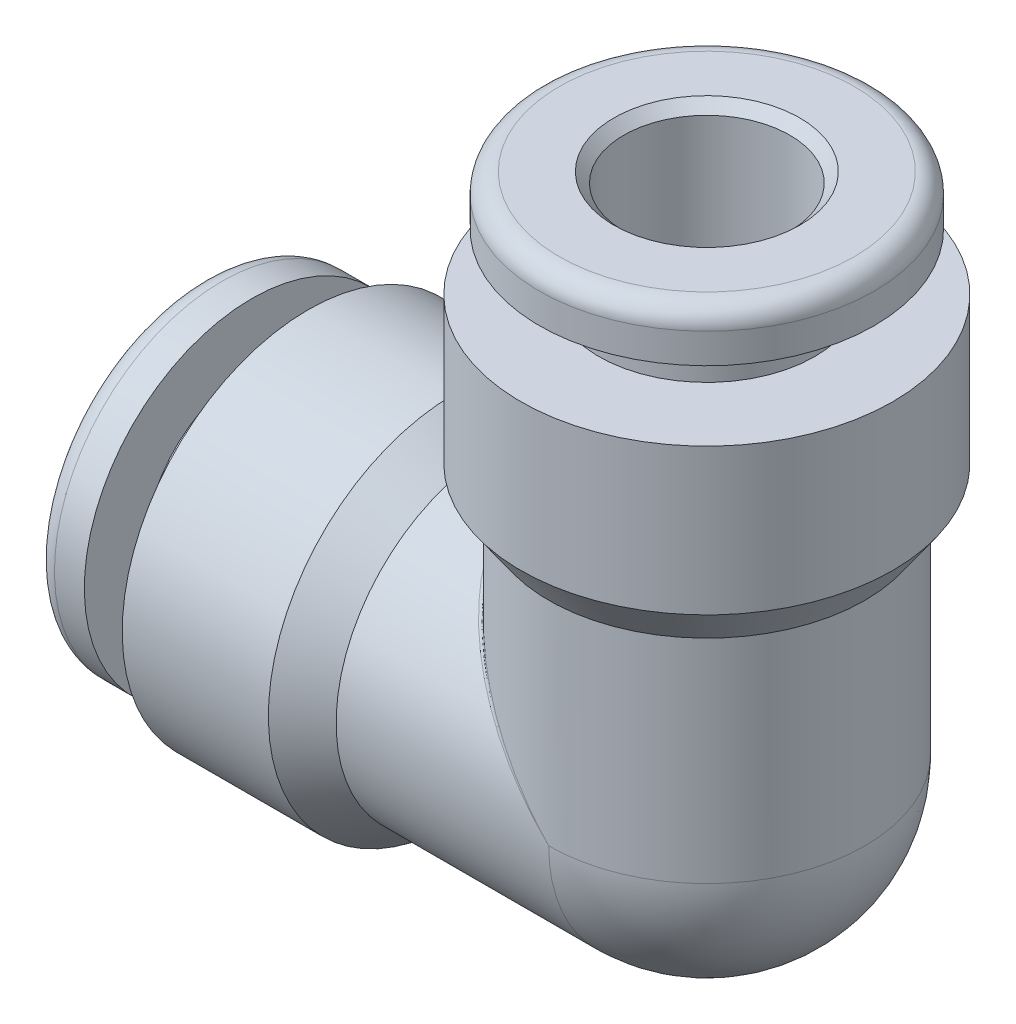
ISO-10303-21;
HEADER;
FILE_DESCRIPTION(('STEP AP214'),'2;1');
FILE_NAME('part.step','',(''),(''),'','','');
FILE_SCHEMA(('AUTOMOTIVE_DESIGN { 1 0 10303 214 1 1 1 1 }'));
ENDSEC;
DATA;
#1=APPLICATION_CONTEXT('core data for automotive mechanical design processes');
#2=APPLICATION_PROTOCOL_DEFINITION('international standard','automotive_design',2000,#1);
#3=PRODUCT_CONTEXT('',#1,'mechanical');
#4=PRODUCT('Part','Part','',(#3));
#5=PRODUCT_RELATED_PRODUCT_CATEGORY('part','',(#4));
#6=PRODUCT_DEFINITION_FORMATION('','',#4);
#7=PRODUCT_DEFINITION_CONTEXT('part definition',#1,'design');
#8=PRODUCT_DEFINITION('design','',#6,#7);
#9=PRODUCT_DEFINITION_SHAPE('','',#8);
#10=(LENGTH_UNIT() NAMED_UNIT(*) SI_UNIT(.MILLI.,.METRE.));
#11=(NAMED_UNIT(*) PLANE_ANGLE_UNIT() SI_UNIT($,.RADIAN.));
#12=(NAMED_UNIT(*) SI_UNIT($,.STERADIAN.) SOLID_ANGLE_UNIT());
#13=UNCERTAINTY_MEASURE_WITH_UNIT(LENGTH_MEASURE(1.E-05),#10,'distance_accuracy_value','');
#14=(GEOMETRIC_REPRESENTATION_CONTEXT(3) GLOBAL_UNCERTAINTY_ASSIGNED_CONTEXT((#13)) GLOBAL_UNIT_ASSIGNED_CONTEXT((#10,
#11,#12)) REPRESENTATION_CONTEXT('',''));
#15=CARTESIAN_POINT('',(0.,0.,0.));
#16=DIRECTION('',(0.,0.,1.));
#17=DIRECTION('',(1.,0.,0.));
#18=AXIS2_PLACEMENT_3D('',#15,#16,#17);
#19=CARTESIAN_POINT('',(-8.12845170640751,0.,0.));
#20=DIRECTION('',(-1.,0.,0.));
#21=DIRECTION('',(0.,-1.,0.));
#22=AXIS2_PLACEMENT_3D('',#19,#20,#21);
#23=CONICAL_SURFACE('',#22,6.0452,0.610865238198017);
#24=CARTESIAN_POINT('',(-9.652,0.,0.));
#25=DIRECTION('',(1.,0.,0.));
#26=DIRECTION('',(0.,1.,0.));
#27=AXIS2_PLACEMENT_3D('',#24,#25,#26);
#28=CIRCLE('',#27,7.112);
#29=CARTESIAN_POINT('',(-9.652,7.112,0.));
#30=VERTEX_POINT('',#29);
#31=EDGE_CURVE('E71',#30,#30,#28,.T.);
#32=ORIENTED_EDGE('',*,*,#31,.T.);
#33=EDGE_LOOP('',(#32));
#34=FACE_BOUND('',#33,.T.);
#35=CARTESIAN_POINT('',(-8.12845170640751,0.,0.));
#36=DIRECTION('',(1.,0.,0.));
#37=DIRECTION('',(0.,1.,0.));
#38=AXIS2_PLACEMENT_3D('',#35,#36,#37);
#39=CIRCLE('',#38,6.0452);
#40=CARTESIAN_POINT('',(-8.12845170640751,6.0452,0.));
#41=VERTEX_POINT('',#40);
#42=EDGE_CURVE('E77',#41,#41,#39,.T.);
#43=ORIENTED_EDGE('',*,*,#42,.F.);
#44=EDGE_LOOP('',(#43));
#45=FACE_BOUND('',#44,.T.);
#46=ADVANCED_FACE('F34',(#34,#45),#23,.T.);
#47=CARTESIAN_POINT('',(0.,0.,0.));
#48=DIRECTION('',(1.,0.,0.));
#49=DIRECTION('',(0.,1.,0.));
#50=AXIS2_PLACEMENT_3D('',#47,#48,#49);
#51=CYLINDRICAL_SURFACE('',#50,7.112);
#52=CARTESIAN_POINT('',(-15.24,0.,0.));
#53=DIRECTION('',(1.,0.,0.));
#54=DIRECTION('',(0.,1.,0.));
#55=AXIS2_PLACEMENT_3D('',#52,#53,#54);
#56=CIRCLE('',#55,7.112);
#57=CARTESIAN_POINT('',(-15.24,7.112,0.));
#58=VERTEX_POINT('',#57);
#59=EDGE_CURVE('E153',#58,#58,#56,.T.);
#60=ORIENTED_EDGE('',*,*,#59,.T.);
#61=EDGE_LOOP('',(#60));
#62=FACE_BOUND('',#61,.T.);
#63=ORIENTED_EDGE('',*,*,#31,.F.);
#64=EDGE_LOOP('',(#63));
#65=FACE_BOUND('',#64,.T.);
#66=ADVANCED_FACE('F161',(#62,#65),#51,.T.);
#67=CARTESIAN_POINT('',(-15.24,7.112,0.));
#68=DIRECTION('',(-1.,0.,0.));
#69=DIRECTION('',(0.,-1.,0.));
#70=AXIS2_PLACEMENT_3D('',#67,#68,#69);
#71=PLANE('',#70);
#72=CARTESIAN_POINT('',(-15.24,0.,0.));
#73=DIRECTION('',(1.,0.,0.));
#74=DIRECTION('',(0.,1.,0.));
#75=AXIS2_PLACEMENT_3D('',#72,#73,#74);
#76=CIRCLE('',#75,4.1275);
#77=CARTESIAN_POINT('',(-15.24,4.1275,0.));
#78=VERTEX_POINT('',#77);
#79=EDGE_CURVE('E150',#78,#78,#76,.T.);
#80=ORIENTED_EDGE('',*,*,#79,.T.);
#81=EDGE_LOOP('',(#80));
#82=FACE_BOUND('',#81,.T.);
#83=ORIENTED_EDGE('',*,*,#59,.F.);
#84=EDGE_LOOP('',(#83));
#85=FACE_BOUND('',#84,.T.);
#86=ADVANCED_FACE('F163',(#82,#85),#71,.T.);
#87=CARTESIAN_POINT('',(0.,0.,0.));
#88=DIRECTION('',(1.,0.,0.));
#89=DIRECTION('',(0.,1.,0.));
#90=AXIS2_PLACEMENT_3D('',#87,#88,#89);
#91=CYLINDRICAL_SURFACE('',#90,4.1275);
#92=CARTESIAN_POINT('',(-17.399,0.,0.));
#93=DIRECTION('',(1.,0.,0.));
#94=DIRECTION('',(0.,1.,0.));
#95=AXIS2_PLACEMENT_3D('',#92,#93,#94);
#96=CIRCLE('',#95,4.1275);
#97=CARTESIAN_POINT('',(-17.399,4.1275,0.));
#98=VERTEX_POINT('',#97);
#99=EDGE_CURVE('E147',#98,#98,#96,.T.);
#100=ORIENTED_EDGE('',*,*,#99,.T.);
#101=EDGE_LOOP('',(#100));
#102=FACE_BOUND('',#101,.T.);
#103=ORIENTED_EDGE('',*,*,#79,.F.);
#104=EDGE_LOOP('',(#103));
#105=FACE_BOUND('',#104,.T.);
#106=ADVANCED_FACE('F170',(#102,#105),#91,.T.);
#107=CARTESIAN_POINT('',(-17.399,6.4008,0.));
#108=DIRECTION('',(1.,0.,0.));
#109=DIRECTION('',(0.,1.,0.));
#110=AXIS2_PLACEMENT_3D('',#107,#108,#109);
#111=PLANE('',#110);
#112=CARTESIAN_POINT('',(-17.399,0.,0.));
#113=DIRECTION('',(1.,0.,0.));
#114=DIRECTION('',(0.,1.,0.));
#115=AXIS2_PLACEMENT_3D('',#112,#113,#114);
#116=CIRCLE('',#115,6.4008);
#117=CARTESIAN_POINT('',(-17.399,6.4008,0.));
#118=VERTEX_POINT('',#117);
#119=EDGE_CURVE('E144',#118,#118,#116,.T.);
#120=ORIENTED_EDGE('',*,*,#119,.T.);
#121=EDGE_LOOP('',(#120));
#122=FACE_BOUND('',#121,.T.);
#123=ORIENTED_EDGE('',*,*,#99,.F.);
#124=EDGE_LOOP('',(#123));
#125=FACE_BOUND('',#124,.T.);
#126=ADVANCED_FACE('F176',(#122,#125),#111,.T.);
#127=CARTESIAN_POINT('',(0.,0.,0.));
#128=DIRECTION('',(1.,0.,0.));
#129=DIRECTION('',(0.,1.,0.));
#130=AXIS2_PLACEMENT_3D('',#127,#128,#129);
#131=CYLINDRICAL_SURFACE('',#130,6.4008);
#132=CARTESIAN_POINT('',(-18.542,0.,0.));
#133=DIRECTION('',(1.,0.,0.));
#134=DIRECTION('',(0.,1.,0.));
#135=AXIS2_PLACEMENT_3D('',#132,#133,#134);
#136=CIRCLE('',#135,6.4008);
#137=CARTESIAN_POINT('',(-18.542,6.4008,0.));
#138=VERTEX_POINT('',#137);
#139=EDGE_CURVE('E141',#138,#138,#136,.T.);
#140=ORIENTED_EDGE('',*,*,#139,.T.);
#141=EDGE_LOOP('',(#140));
#142=FACE_BOUND('',#141,.T.);
#143=ORIENTED_EDGE('',*,*,#119,.F.);
#144=EDGE_LOOP('',(#143));
#145=FACE_BOUND('',#144,.T.);
#146=ADVANCED_FACE('F180',(#142,#145),#131,.T.);
#147=CARTESIAN_POINT('',(-18.542,0.,0.));
#148=DIRECTION('',(1.,0.,0.));
#149=DIRECTION('',(0.,1.,0.));
#150=AXIS2_PLACEMENT_3D('',#147,#148,#149);
#151=TOROIDAL_SURFACE('',#150,5.6388,0.761999999999999);
#152=CARTESIAN_POINT('',(-19.304,0.,0.));
#153=DIRECTION('',(1.,0.,0.));
#154=DIRECTION('',(0.,1.,0.));
#155=AXIS2_PLACEMENT_3D('',#152,#153,#154);
#156=CIRCLE('',#155,5.6388);
#157=CARTESIAN_POINT('',(-19.304,5.6388,0.));
#158=VERTEX_POINT('',#157);
#159=EDGE_CURVE('E138',#158,#158,#156,.T.);
#160=ORIENTED_EDGE('',*,*,#159,.T.);
#161=EDGE_LOOP('',(#160));
#162=FACE_BOUND('',#161,.T.);
#163=ORIENTED_EDGE('',*,*,#139,.F.);
#164=EDGE_LOOP('',(#163));
#165=FACE_BOUND('',#164,.T.);
#166=ADVANCED_FACE('F184',(#162,#165),#151,.T.);
#167=CARTESIAN_POINT('',(-19.304,5.6388,0.));
#168=DIRECTION('',(-1.,0.,0.));
#169=DIRECTION('',(0.,-1.,0.));
#170=AXIS2_PLACEMENT_3D('',#167,#168,#169);
#171=PLANE('',#170);
#172=CARTESIAN_POINT('',(-19.304,0.,0.));
#173=DIRECTION('',(1.,0.,0.));
#174=DIRECTION('',(0.,1.,0.));
#175=AXIS2_PLACEMENT_3D('',#172,#173,#174);
#176=CIRCLE('',#175,3.556);
#177=CARTESIAN_POINT('',(-19.304,3.556,0.));
#178=VERTEX_POINT('',#177);
#179=EDGE_CURVE('E135',#178,#178,#176,.T.);
#180=ORIENTED_EDGE('',*,*,#179,.T.);
#181=EDGE_LOOP('',(#180));
#182=FACE_BOUND('',#181,.T.);
#183=ORIENTED_EDGE('',*,*,#159,.F.);
#184=EDGE_LOOP('',(#183));
#185=FACE_BOUND('',#184,.T.);
#186=ADVANCED_FACE('F188',(#182,#185),#171,.T.);
#187=CARTESIAN_POINT('',(-19.304,0.,0.));
#188=DIRECTION('',(-1.,0.,0.));
#189=DIRECTION('',(0.,-1.,0.));
#190=AXIS2_PLACEMENT_3D('',#187,#188,#189);
#191=CONICAL_SURFACE('',#190,3.556,0.785398163397449);
#192=CARTESIAN_POINT('',(-18.923,0.,0.));
#193=DIRECTION('',(1.,0.,0.));
#194=DIRECTION('',(0.,1.,0.));
#195=AXIS2_PLACEMENT_3D('',#192,#193,#194);
#196=CIRCLE('',#195,3.175);
#197=CARTESIAN_POINT('',(-18.923,3.175,0.));
#198=VERTEX_POINT('',#197);
#199=EDGE_CURVE('E132',#198,#198,#196,.T.);
#200=ORIENTED_EDGE('',*,*,#199,.T.);
#201=EDGE_LOOP('',(#200));
#202=FACE_BOUND('',#201,.T.);
#203=ORIENTED_EDGE('',*,*,#179,.F.);
#204=EDGE_LOOP('',(#203));
#205=FACE_BOUND('',#204,.T.);
#206=ADVANCED_FACE('F192',(#202,#205),#191,.F.);
#207=CARTESIAN_POINT('',(0.,0.,0.));
#208=DIRECTION('',(1.,0.,0.));
#209=DIRECTION('',(0.,1.,0.));
#210=AXIS2_PLACEMENT_3D('',#207,#208,#209);
#211=CYLINDRICAL_SURFACE('',#210,3.175);
#212=CARTESIAN_POINT('',(-9.652,0.,0.));
#213=DIRECTION('',(1.,0.,0.));
#214=DIRECTION('',(0.,1.,0.));
#215=AXIS2_PLACEMENT_3D('',#212,#213,#214);
#216=CIRCLE('',#215,3.175);
#217=CARTESIAN_POINT('',(-9.652,3.175,0.));
#218=VERTEX_POINT('',#217);
#219=EDGE_CURVE('E129',#218,#218,#216,.T.);
#220=ORIENTED_EDGE('',*,*,#219,.T.);
#221=EDGE_LOOP('',(#220));
#222=FACE_BOUND('',#221,.T.);
#223=ORIENTED_EDGE('',*,*,#199,.F.);
#224=EDGE_LOOP('',(#223));
#225=FACE_BOUND('',#224,.T.);
#226=ADVANCED_FACE('F196',(#222,#225),#211,.F.);
#227=CARTESIAN_POINT('',(-9.652,3.175,0.));
#228=DIRECTION('',(-1.,0.,0.));
#229=DIRECTION('',(0.,-1.,0.));
#230=AXIS2_PLACEMENT_3D('',#227,#228,#229);
#231=PLANE('',#230);
#232=CARTESIAN_POINT('',(-9.652,0.,0.));
#233=DIRECTION('',(1.,0.,0.));
#234=DIRECTION('',(0.,1.,0.));
#235=AXIS2_PLACEMENT_3D('',#232,#233,#234);
#236=CIRCLE('',#235,2.69875);
#237=CARTESIAN_POINT('',(-9.652,2.69875,0.));
#238=VERTEX_POINT('',#237);
#239=EDGE_CURVE('E126',#238,#238,#236,.T.);
#240=ORIENTED_EDGE('',*,*,#239,.T.);
#241=EDGE_LOOP('',(#240));
#242=FACE_BOUND('',#241,.T.);
#243=ORIENTED_EDGE('',*,*,#219,.F.);
#244=EDGE_LOOP('',(#243));
#245=FACE_BOUND('',#244,.T.);
#246=ADVANCED_FACE('F200',(#242,#245),#231,.T.);
#247=CARTESIAN_POINT('',(0.,0.,0.));
#248=DIRECTION('',(1.,0.,0.));
#249=DIRECTION('',(0.,1.,0.));
#250=AXIS2_PLACEMENT_3D('',#247,#248,#249);
#251=CYLINDRICAL_SURFACE('',#250,2.69875);
#252=CARTESIAN_POINT('',(0.,0.,0.));
#253=DIRECTION('',(1.,0.,0.));
#254=DIRECTION('',(0.,1.,0.));
#255=AXIS2_PLACEMENT_3D('',#252,#253,#254);
#256=CIRCLE('',#255,2.69875);
#257=CARTESIAN_POINT('',(0.,0.,2.69875));
#258=VERTEX_POINT('',#257);
#259=CARTESIAN_POINT('',(0.,0.,-2.69875));
#260=VERTEX_POINT('',#259);
#261=EDGE_CURVE('E58',#258,#260,#256,.T.);
#262=ORIENTED_EDGE('',*,*,#261,.T.);
#263=CARTESIAN_POINT('',(0.,0.,0.));
#264=DIRECTION('',(-0.707106781186549,-0.707106781186546,0.));
#265=DIRECTION('',(0.707106781186546,-0.707106781186549,0.));
#266=AXIS2_PLACEMENT_3D('',#263,#264,#265);
#267=ELLIPSE('',#266,3.81660885145438,2.69875);
#268=EDGE_CURVE('E87',#260,#258,#267,.F.);
#269=ORIENTED_EDGE('',*,*,#268,.T.);
#270=EDGE_LOOP('',(#262,#269));
#271=FACE_BOUND('',#270,.T.);
#272=ORIENTED_EDGE('',*,*,#239,.F.);
#273=EDGE_LOOP('',(#272));
#274=FACE_BOUND('',#273,.T.);
#275=ADVANCED_FACE('F204',(#271,#274),#251,.F.);
#276=CARTESIAN_POINT('',(0.,0.,0.));
#277=DIRECTION('',(1.,0.,0.));
#278=DIRECTION('',(0.,1.,0.));
#279=AXIS2_PLACEMENT_3D('',#276,#277,#278);
#280=CYLINDRICAL_SURFACE('',#279,6.0452);
#281=CARTESIAN_POINT('',(0.,0.,0.));
#282=DIRECTION('',(1.,0.,0.));
#283=DIRECTION('',(0.,1.,0.));
#284=AXIS2_PLACEMENT_3D('',#281,#282,#283);
#285=CIRCLE('',#284,6.0452);
#286=CARTESIAN_POINT('',(0.,0.,6.0452));
#287=VERTEX_POINT('',#286);
#288=CARTESIAN_POINT('',(0.,0.,-6.0452));
#289=VERTEX_POINT('',#288);
#290=EDGE_CURVE('E73',#287,#289,#285,.T.);
#291=ORIENTED_EDGE('',*,*,#290,.F.);
#292=CARTESIAN_POINT('',(0.,0.,0.));
#293=DIRECTION('',(0.692410699000966,0.721503585513609,0.));
#294=DIRECTION('',(0.721503585513609,-0.692410699000966,0.));
#295=AXIS2_PLACEMENT_3D('',#292,#293,#294);
#296=ELLIPSE('',#295,8.73065654346795,6.0452);
#297=EDGE_CURVE('E11',#287,#289,#296,.F.);
#298=ORIENTED_EDGE('',*,*,#297,.T.);
#299=EDGE_LOOP('',(#291,#298));
#300=FACE_BOUND('',#299,.T.);
#301=ORIENTED_EDGE('',*,*,#42,.T.);
#302=EDGE_LOOP('',(#301));
#303=FACE_BOUND('',#302,.T.);
#304=ADVANCED_FACE('F74',(#300,#303),#280,.T.);
#305=CARTESIAN_POINT('',(0.,0.,0.));
#306=DIRECTION('',(0.,-1.,0.));
#307=DIRECTION('',(1.,0.,0.));
#308=AXIS2_PLACEMENT_3D('',#305,#306,#307);
#309=CYLINDRICAL_SURFACE('',#308,6.0452);
#310=CARTESIAN_POINT('',(0.,8.12845170640751,0.));
#311=DIRECTION('',(0.,-1.,0.));
#312=DIRECTION('',(1.,0.,0.));
#313=AXIS2_PLACEMENT_3D('',#310,#311,#312);
#314=CIRCLE('',#313,6.0452);
#315=CARTESIAN_POINT('',(6.04520000000003,8.12845170640749,0.));
#316=VERTEX_POINT('',#315);
#317=EDGE_CURVE('E81',#316,#316,#314,.T.);
#318=ORIENTED_EDGE('',*,*,#317,.T.);
#319=EDGE_LOOP('',(#318));
#320=FACE_BOUND('',#319,.T.);
#321=CARTESIAN_POINT('',(0.,0.,0.));
#322=DIRECTION('',(0.,-1.,0.));
#323=DIRECTION('',(1.,0.,0.));
#324=AXIS2_PLACEMENT_3D('',#321,#322,#323);
#325=CIRCLE('',#324,6.0452);
#326=EDGE_CURVE('E69',#289,#287,#325,.T.);
#327=ORIENTED_EDGE('',*,*,#326,.F.);
#328=CARTESIAN_POINT('',(0.,0.,0.));
#329=DIRECTION('',(0.721503585513611,0.692410699000964,0.));
#330=DIRECTION('',(0.692410699000964,-0.721503585513611,0.));
#331=AXIS2_PLACEMENT_3D('',#328,#329,#330);
#332=ELLIPSE('',#331,8.73065654346795,6.0452);
#333=EDGE_CURVE('E47',#289,#287,#332,.T.);
#334=ORIENTED_EDGE('',*,*,#333,.T.);
#335=EDGE_LOOP('',(#327,#334));
#336=FACE_BOUND('',#335,.T.);
#337=ADVANCED_FACE('F67',(#320,#336),#309,.T.);
#338=CARTESIAN_POINT('',(3.17500000000003,9.65199999999999,0.));
#339=DIRECTION('',(0.,1.,0.));
#340=DIRECTION('',(-1.,0.,0.));
#341=AXIS2_PLACEMENT_3D('',#338,#339,#340);
#342=PLANE('',#341);
#343=CARTESIAN_POINT('',(0.,9.652,0.));
#344=DIRECTION('',(0.,-1.,0.));
#345=DIRECTION('',(1.,0.,0.));
#346=AXIS2_PLACEMENT_3D('',#343,#344,#345);
#347=CIRCLE('',#346,2.69875);
#348=CARTESIAN_POINT('',(2.69875000000003,9.65199999999999,0.));
#349=VERTEX_POINT('',#348);
#350=EDGE_CURVE('E84',#349,#349,#347,.T.);
#351=ORIENTED_EDGE('',*,*,#350,.T.);
#352=EDGE_LOOP('',(#351));
#353=FACE_BOUND('',#352,.T.);
#354=CARTESIAN_POINT('',(0.,9.652,0.));
#355=DIRECTION('',(0.,-1.,0.));
#356=DIRECTION('',(1.,0.,0.));
#357=AXIS2_PLACEMENT_3D('',#354,#355,#356);
#358=CIRCLE('',#357,3.175);
#359=CARTESIAN_POINT('',(3.17500000000003,9.65199999999999,0.));
#360=VERTEX_POINT('',#359);
#361=EDGE_CURVE('E93',#360,#360,#358,.T.);
#362=ORIENTED_EDGE('',*,*,#361,.F.);
#363=EDGE_LOOP('',(#362));
#364=FACE_BOUND('',#363,.T.);
#365=ADVANCED_FACE('F251',(#353,#364),#342,.T.);
#366=CARTESIAN_POINT('',(0.,0.,0.));
#367=DIRECTION('',(0.,-1.,0.));
#368=DIRECTION('',(1.,0.,0.));
#369=AXIS2_PLACEMENT_3D('',#366,#367,#368);
#370=CYLINDRICAL_SURFACE('',#369,3.175);
#371=ORIENTED_EDGE('',*,*,#361,.T.);
#372=EDGE_LOOP('',(#371));
#373=FACE_BOUND('',#372,.T.);
#374=CARTESIAN_POINT('',(0.,18.923,0.));
#375=DIRECTION('',(0.,-1.,0.));
#376=DIRECTION('',(1.,0.,0.));
#377=AXIS2_PLACEMENT_3D('',#374,#375,#376);
#378=CIRCLE('',#377,3.175);
#379=CARTESIAN_POINT('',(3.17500000000006,18.923,0.));
#380=VERTEX_POINT('',#379);
#381=EDGE_CURVE('E96',#380,#380,#378,.T.);
#382=ORIENTED_EDGE('',*,*,#381,.F.);
#383=EDGE_LOOP('',(#382));
#384=FACE_BOUND('',#383,.T.);
#385=ADVANCED_FACE('F247',(#373,#384),#370,.F.);
#386=CARTESIAN_POINT('',(0.,19.304,0.));
#387=DIRECTION('',(0.,1.,0.));
#388=DIRECTION('',(-1.,0.,0.));
#389=AXIS2_PLACEMENT_3D('',#386,#387,#388);
#390=CONICAL_SURFACE('',#389,3.556,0.785398163397449);
#391=ORIENTED_EDGE('',*,*,#381,.T.);
#392=EDGE_LOOP('',(#391));
#393=FACE_BOUND('',#392,.T.);
#394=CARTESIAN_POINT('',(0.,19.304,0.));
#395=DIRECTION('',(0.,-1.,0.));
#396=DIRECTION('',(1.,0.,0.));
#397=AXIS2_PLACEMENT_3D('',#394,#395,#396);
#398=CIRCLE('',#397,3.556);
#399=CARTESIAN_POINT('',(3.55600000000006,19.304,0.));
#400=VERTEX_POINT('',#399);
#401=EDGE_CURVE('E99',#400,#400,#398,.T.);
#402=ORIENTED_EDGE('',*,*,#401,.F.);
#403=EDGE_LOOP('',(#402));
#404=FACE_BOUND('',#403,.T.);
#405=ADVANCED_FACE('F243',(#393,#404),#390,.F.);
#406=CARTESIAN_POINT('',(5.63880000000007,19.304,0.));
#407=DIRECTION('',(0.,1.,0.));
#408=DIRECTION('',(-1.,0.,0.));
#409=AXIS2_PLACEMENT_3D('',#406,#407,#408);
#410=PLANE('',#409);
#411=ORIENTED_EDGE('',*,*,#401,.T.);
#412=EDGE_LOOP('',(#411));
#413=FACE_BOUND('',#412,.T.);
#414=CARTESIAN_POINT('',(0.,19.304,0.));
#415=DIRECTION('',(0.,-1.,0.));
#416=DIRECTION('',(1.,0.,0.));
#417=AXIS2_PLACEMENT_3D('',#414,#415,#416);
#418=CIRCLE('',#417,5.6388);
#419=CARTESIAN_POINT('',(5.63880000000007,19.304,0.));
#420=VERTEX_POINT('',#419);
#421=EDGE_CURVE('E102',#420,#420,#418,.T.);
#422=ORIENTED_EDGE('',*,*,#421,.F.);
#423=EDGE_LOOP('',(#422));
#424=FACE_BOUND('',#423,.T.);
#425=ADVANCED_FACE('F239',(#413,#424),#410,.T.);
#426=CARTESIAN_POINT('',(0.,18.542,0.));
#427=DIRECTION('',(0.,-1.,0.));
#428=DIRECTION('',(1.,0.,0.));
#429=AXIS2_PLACEMENT_3D('',#426,#427,#428);
#430=TOROIDAL_SURFACE('',#429,5.6388,0.761999999999999);
#431=ORIENTED_EDGE('',*,*,#421,.T.);
#432=EDGE_LOOP('',(#431));
#433=FACE_BOUND('',#432,.T.);
#434=CARTESIAN_POINT('',(0.,18.542,0.));
#435=DIRECTION('',(0.,-1.,0.));
#436=DIRECTION('',(1.,0.,0.));
#437=AXIS2_PLACEMENT_3D('',#434,#435,#436);
#438=CIRCLE('',#437,6.4008);
#439=CARTESIAN_POINT('',(6.40080000000006,18.542,0.));
#440=VERTEX_POINT('',#439);
#441=EDGE_CURVE('E105',#440,#440,#438,.T.);
#442=ORIENTED_EDGE('',*,*,#441,.F.);
#443=EDGE_LOOP('',(#442));
#444=FACE_BOUND('',#443,.T.);
#445=ADVANCED_FACE('F235',(#433,#444),#430,.T.);
#446=CARTESIAN_POINT('',(0.,0.,0.));
#447=DIRECTION('',(0.,-1.,0.));
#448=DIRECTION('',(1.,0.,0.));
#449=AXIS2_PLACEMENT_3D('',#446,#447,#448);
#450=CYLINDRICAL_SURFACE('',#449,6.4008);
#451=ORIENTED_EDGE('',*,*,#441,.T.);
#452=EDGE_LOOP('',(#451));
#453=FACE_BOUND('',#452,.T.);
#454=CARTESIAN_POINT('',(0.,17.399,0.));
#455=DIRECTION('',(0.,-1.,0.));
#456=DIRECTION('',(1.,0.,0.));
#457=AXIS2_PLACEMENT_3D('',#454,#455,#456);
#458=CIRCLE('',#457,6.4008);
#459=CARTESIAN_POINT('',(6.40080000000006,17.399,0.));
#460=VERTEX_POINT('',#459);
#461=EDGE_CURVE('E108',#460,#460,#458,.T.);
#462=ORIENTED_EDGE('',*,*,#461,.F.);
#463=EDGE_LOOP('',(#462));
#464=FACE_BOUND('',#463,.T.);
#465=ADVANCED_FACE('F231',(#453,#464),#450,.T.);
#466=CARTESIAN_POINT('',(6.40080000000006,17.399,0.));
#467=DIRECTION('',(0.,-1.,0.));
#468=DIRECTION('',(1.,0.,0.));
#469=AXIS2_PLACEMENT_3D('',#466,#467,#468);
#470=PLANE('',#469);
#471=ORIENTED_EDGE('',*,*,#461,.T.);
#472=EDGE_LOOP('',(#471));
#473=FACE_BOUND('',#472,.T.);
#474=CARTESIAN_POINT('',(0.,17.399,0.));
#475=DIRECTION('',(0.,-1.,0.));
#476=DIRECTION('',(1.,0.,0.));
#477=AXIS2_PLACEMENT_3D('',#474,#475,#476);
#478=CIRCLE('',#477,4.1275);
#479=CARTESIAN_POINT('',(4.12750000000006,17.399,0.));
#480=VERTEX_POINT('',#479);
#481=EDGE_CURVE('E111',#480,#480,#478,.T.);
#482=ORIENTED_EDGE('',*,*,#481,.F.);
#483=EDGE_LOOP('',(#482));
#484=FACE_BOUND('',#483,.T.);
#485=ADVANCED_FACE('F227',(#473,#484),#470,.T.);
#486=CARTESIAN_POINT('',(0.,0.,0.));
#487=DIRECTION('',(0.,-1.,0.));
#488=DIRECTION('',(1.,0.,0.));
#489=AXIS2_PLACEMENT_3D('',#486,#487,#488);
#490=CYLINDRICAL_SURFACE('',#489,4.1275);
#491=ORIENTED_EDGE('',*,*,#481,.T.);
#492=EDGE_LOOP('',(#491));
#493=FACE_BOUND('',#492,.T.);
#494=CARTESIAN_POINT('',(0.,15.24,0.));
#495=DIRECTION('',(0.,-1.,0.));
#496=DIRECTION('',(1.,0.,0.));
#497=AXIS2_PLACEMENT_3D('',#494,#495,#496);
#498=CIRCLE('',#497,4.1275);
#499=CARTESIAN_POINT('',(4.12750000000005,15.24,0.));
#500=VERTEX_POINT('',#499);
#501=EDGE_CURVE('E114',#500,#500,#498,.T.);
#502=ORIENTED_EDGE('',*,*,#501,.F.);
#503=EDGE_LOOP('',(#502));
#504=FACE_BOUND('',#503,.T.);
#505=ADVANCED_FACE('F223',(#493,#504),#490,.T.);
#506=CARTESIAN_POINT('',(7.11200000000005,15.24,0.));
#507=DIRECTION('',(0.,1.,0.));
#508=DIRECTION('',(-1.,0.,0.));
#509=AXIS2_PLACEMENT_3D('',#506,#507,#508);
#510=PLANE('',#509);
#511=ORIENTED_EDGE('',*,*,#501,.T.);
#512=EDGE_LOOP('',(#511));
#513=FACE_BOUND('',#512,.T.);
#514=CARTESIAN_POINT('',(0.,15.24,0.));
#515=DIRECTION('',(0.,-1.,0.));
#516=DIRECTION('',(1.,0.,0.));
#517=AXIS2_PLACEMENT_3D('',#514,#515,#516);
#518=CIRCLE('',#517,7.112);
#519=CARTESIAN_POINT('',(7.11200000000005,15.24,0.));
#520=VERTEX_POINT('',#519);
#521=EDGE_CURVE('E117',#520,#520,#518,.T.);
#522=ORIENTED_EDGE('',*,*,#521,.F.);
#523=EDGE_LOOP('',(#522));
#524=FACE_BOUND('',#523,.T.);
#525=ADVANCED_FACE('F219',(#513,#524),#510,.T.);
#526=CARTESIAN_POINT('',(0.,0.,0.));
#527=DIRECTION('',(0.,-1.,0.));
#528=DIRECTION('',(1.,0.,0.));
#529=AXIS2_PLACEMENT_3D('',#526,#527,#528);
#530=CYLINDRICAL_SURFACE('',#529,7.112);
#531=ORIENTED_EDGE('',*,*,#521,.T.);
#532=EDGE_LOOP('',(#531));
#533=FACE_BOUND('',#532,.T.);
#534=CARTESIAN_POINT('',(0.,9.652,0.));
#535=DIRECTION('',(0.,-1.,0.));
#536=DIRECTION('',(1.,0.,0.));
#537=AXIS2_PLACEMENT_3D('',#534,#535,#536);
#538=CIRCLE('',#537,7.112);
#539=CARTESIAN_POINT('',(7.11200000000003,9.65199999999997,0.));
#540=VERTEX_POINT('',#539);
#541=EDGE_CURVE('E120',#540,#540,#538,.T.);
#542=ORIENTED_EDGE('',*,*,#541,.F.);
#543=EDGE_LOOP('',(#542));
#544=FACE_BOUND('',#543,.T.);
#545=ADVANCED_FACE('F215',(#533,#544),#530,.T.);
#546=CARTESIAN_POINT('',(0.,8.12845170640751,0.));
#547=DIRECTION('',(0.,1.,0.));
#548=DIRECTION('',(-1.,0.,0.));
#549=AXIS2_PLACEMENT_3D('',#546,#547,#548);
#550=CONICAL_SURFACE('',#549,6.0452,0.610865238198017);
#551=ORIENTED_EDGE('',*,*,#541,.T.);
#552=EDGE_LOOP('',(#551));
#553=FACE_BOUND('',#552,.T.);
#554=ORIENTED_EDGE('',*,*,#317,.F.);
#555=EDGE_LOOP('',(#554));
#556=FACE_BOUND('',#555,.T.);
#557=ADVANCED_FACE('F211',(#553,#556),#550,.T.);
#558=CARTESIAN_POINT('',(0.,0.,0.));
#559=DIRECTION('',(0.,-1.,0.));
#560=DIRECTION('',(1.,0.,0.));
#561=AXIS2_PLACEMENT_3D('',#558,#559,#560);
#562=CYLINDRICAL_SURFACE('',#561,2.69875);
#563=ORIENTED_EDGE('',*,*,#268,.F.);
#564=CARTESIAN_POINT('',(0.,0.,0.));
#565=DIRECTION('',(0.,-1.,0.));
#566=DIRECTION('',(1.,0.,0.));
#567=AXIS2_PLACEMENT_3D('',#564,#565,#566);
#568=CIRCLE('',#567,2.69875);
#569=EDGE_CURVE('E80',#260,#258,#568,.T.);
#570=ORIENTED_EDGE('',*,*,#569,.T.);
#571=EDGE_LOOP('',(#563,#570));
#572=FACE_BOUND('',#571,.T.);
#573=ORIENTED_EDGE('',*,*,#350,.F.);
#574=EDGE_LOOP('',(#573));
#575=FACE_BOUND('',#574,.T.);
#576=ADVANCED_FACE('F214',(#572,#575),#562,.F.);
#577=CARTESIAN_POINT('',(0.,0.,0.));
#578=DIRECTION('',(0.,0.,-1.));
#579=DIRECTION('',(1.,0.,0.));
#580=AXIS2_PLACEMENT_3D('',#577,#578,#579);
#581=SPHERICAL_SURFACE('',#580,2.69875);
#582=ORIENTED_EDGE('',*,*,#261,.F.);
#583=ORIENTED_EDGE('',*,*,#569,.F.);
#584=EDGE_LOOP('',(#582,#583));
#585=FACE_BOUND('',#584,.T.);
#586=ADVANCED_FACE('F257',(#585),#581,.F.);
#587=CARTESIAN_POINT('',(0.,0.,0.));
#588=DIRECTION('',(0.,0.,-1.));
#589=DIRECTION('',(1.,0.,0.));
#590=AXIS2_PLACEMENT_3D('',#587,#588,#589);
#591=SPHERICAL_SURFACE('',#590,6.0452);
#592=ORIENTED_EDGE('',*,*,#290,.T.);
#593=ORIENTED_EDGE('',*,*,#326,.T.);
#594=EDGE_LOOP('',(#592,#593));
#595=FACE_BOUND('',#594,.T.);
#596=ADVANCED_FACE('F79',(#595),#591,.T.);
#597=CARTESIAN_POINT('',(0.,0.,6.0452));
#598=CARTESIAN_POINT('',(0.,0.,6.0452));
#599=CARTESIAN_POINT('',(0.,0.,6.0452));
#600=CARTESIAN_POINT('',(-0.274423054956229,0.263357609191865,6.04509404200131));
#601=CARTESIAN_POINT('',(-0.268943181443889,0.268943181443891,6.04543517441481));
#602=CARTESIAN_POINT('',(-0.263357609191864,0.274423054956229,6.04509404200131));
#603=CARTESIAN_POINT('',(-0.548916179587986,0.526782462669117,6.02798179709156));
#604=CARTESIAN_POINT('',(-0.538627727478572,0.538627727478573,6.02724509481149));
#605=CARTESIAN_POINT('',(-0.526782462669115,0.548916179587987,6.02798179709156));
#606=CARTESIAN_POINT('',(-1.09318202740281,1.04910210694302,5.9592763953787));
#607=CARTESIAN_POINT('',(-1.07159653563246,1.07159653563246,5.95549469791557));
#608=CARTESIAN_POINT('',(-1.04910210694302,1.09318202740281,5.9592763953787));
#609=CARTESIAN_POINT('',(-1.36297504186412,1.30801637082121,5.9079775589439));
#610=CARTESIAN_POINT('',(-1.33640634828913,1.33640634828914,5.90183197386365));
#611=CARTESIAN_POINT('',(-1.30801637082121,1.36297504186412,5.9079775589439));
#612=CARTESIAN_POINT('',(-1.89324609884314,1.81690553034141,5.77160540575776));
#613=CARTESIAN_POINT('',(-1.85481815315157,1.85481815315158,5.7599934007792));
#614=CARTESIAN_POINT('',(-1.8169055303414,1.89324609884315,5.77160540575776));
#615=CARTESIAN_POINT('',(-2.15380447955236,2.0669575247317,5.68711301882956));
#616=CARTESIAN_POINT('',(-2.10992643597127,2.10992643597128,5.67161665616991));
#617=CARTESIAN_POINT('',(-2.0669575247317,2.15380447955236,5.68711301882956));
#618=CARTESIAN_POINT('',(-2.66106848564252,2.55376733702791,5.48547467298393));
#619=CARTESIAN_POINT('',(-2.60433499736744,2.60433499736745,5.46224602708168));
#620=CARTESIAN_POINT('',(-2.5537673370279,2.66106848564252,5.48547467298393));
#621=CARTESIAN_POINT('',(-2.90795724452524,2.7907009040202,5.36918438950898));
#622=CARTESIAN_POINT('',(-2.84509108277432,2.84509108277433,5.34096036010035));
#623=CARTESIAN_POINT('',(-2.79070090402019,2.90795724452525,5.36918438950898));
#624=CARTESIAN_POINT('',(-3.3835512507734,3.24711773259707,5.10567080405623));
#625=CARTESIAN_POINT('',(-3.30647961178832,3.30647961178833,5.06825411014304));
#626=CARTESIAN_POINT('',(-3.24711773259706,3.38355125077341,5.10567080405623));
#627=CARTESIAN_POINT('',(-3.61258514439717,3.46691638857472,4.95954992193595));
#628=CARTESIAN_POINT('',(-3.52847607243064,3.52847607243065,4.91647603943807));
#629=CARTESIAN_POINT('',(-3.46691638857471,3.61258514439718,4.95954992193595));
#630=CARTESIAN_POINT('',(-4.04839553560513,3.88515378013719,4.63862391704391));
#631=CARTESIAN_POINT('',(-3.94844410079582,3.94844410079583,4.58595031692806));
#632=CARTESIAN_POINT('',(-3.88515378013718,4.04839553560514,4.63862391704391));
#633=CARTESIAN_POINT('',(-4.25568705790419,4.08408677331129,4.4651195365569));
#634=CARTESIAN_POINT('',(-4.14762673916904,4.14762673916906,4.40683397767033));
#635=CARTESIAN_POINT('',(-4.08408677331128,4.2556870579042,4.4651195365569));
#636=CARTESIAN_POINT('',(-4.64426964231115,4.4570007051212,4.09220074529074));
#637=CARTESIAN_POINT('',(-4.51863109916506,4.51863109916508,4.02539131798784));
#638=CARTESIAN_POINT('',(-4.45700070512118,4.64426964231116,4.09220074529074));
#639=CARTESIAN_POINT('',(-4.82629215733646,4.63168360260517,3.89420505687121));
#640=CARTESIAN_POINT('',(-4.69143555815073,4.69143555815074,3.82278710066607));
#641=CARTESIAN_POINT('',(-4.63168360260515,4.82629215733647,3.89420505687121));
#642=CARTESIAN_POINT('',(-5.16099549424794,4.95289083722183,3.47558842229702));
#643=CARTESIAN_POINT('',(-5.00709081308574,5.00709081308575,3.39859875109587));
#644=CARTESIAN_POINT('',(-4.95289083722182,5.16099549424796,3.47558842229702));
#645=CARTESIAN_POINT('',(-5.31462742301435,5.10032793015088,3.25638445351955));
#646=CARTESIAN_POINT('',(-5.15062111396437,5.15062111396439,3.17699097766443));
#647=CARTESIAN_POINT('',(-5.10032793015087,5.31462742301436,3.25638445351955));
#648=CARTESIAN_POINT('',(-5.58969579024317,5.36430483095919,2.79914043239327));
#649=CARTESIAN_POINT('',(-5.40605464367936,5.40605464367937,2.7192247312302));
#650=CARTESIAN_POINT('',(-5.36430483095917,5.58969579024319,2.79914043239327));
#651=CARTESIAN_POINT('',(-5.71225445991213,5.48192161878666,2.5623598099588));
#652=CARTESIAN_POINT('',(-5.51829056376779,5.51829056376781,2.4835171287665));
#653=CARTESIAN_POINT('',(-5.48192161878664,5.71225445991215,2.5623598099588));
#654=CARTESIAN_POINT('',(-5.9229189494494,5.68409157245549,2.07423825272947));
#655=CARTESIAN_POINT('',(-5.71046381783873,5.71046381783875,2.00172748692867));
#656=CARTESIAN_POINT('',(-5.68409157245547,5.92291894944942,2.07423825272947));
#657=CARTESIAN_POINT('',(-6.01219127831178,5.76976421063794,1.82383765482972));
#658=CARTESIAN_POINT('',(-5.79041648637289,5.79041648637291,1.75679815031782));
#659=CARTESIAN_POINT('',(-5.76976421063792,6.0121912783118,1.82383765482972));
#660=CARTESIAN_POINT('',(-6.15475567438026,5.90658004234881,1.31317173634636));
#661=CARTESIAN_POINT('',(-5.91818037394683,5.91818037394685,1.25994214476998));
#662=CARTESIAN_POINT('',(-5.90658004234879,6.15475567438027,1.31317173634636));
#663=CARTESIAN_POINT('',(-6.20904761532833,5.95868279212962,1.05342837731653));
#664=CARTESIAN_POINT('',(-5.96581915737885,5.96581915737887,1.00999102046534));
#665=CARTESIAN_POINT('',(-5.95868279212961,6.20904761532835,1.05342837731653));
#666=CARTESIAN_POINT('',(-6.28097639230726,6.02771121519811,0.529022934581731));
#667=CARTESIAN_POINT('',(-6.02941065238935,6.02941065238937,0.50540341351502));
#668=CARTESIAN_POINT('',(-6.02771121519809,6.28097639230728,0.529022934581731));
#669=CARTESIAN_POINT('',(-6.29919999999998,6.0452,0.264511467290866));
#670=CARTESIAN_POINT('',(-6.04519999999998,6.0452,0.253439114524107));
#671=CARTESIAN_POINT('',(-6.04519999999998,6.2992,0.264511467290866));
#672=CARTESIAN_POINT('',(-6.29919999999998,6.0452,-0.264511467290864));
#673=CARTESIAN_POINT('',(-6.04519999999998,6.0452,-0.253439114524105));
#674=CARTESIAN_POINT('',(-6.04519999999998,6.2992,-0.264511467290864));
#675=CARTESIAN_POINT('',(-6.28097639230726,6.02771121519811,-0.529022934581729));
#676=CARTESIAN_POINT('',(-6.02941065238935,6.02941065238937,-0.505403413515019));
#677=CARTESIAN_POINT('',(-6.02771121519809,6.28097639230728,-0.529022934581729));
#678=CARTESIAN_POINT('',(-6.20904761532833,5.95868279212962,-1.05342837731652));
#679=CARTESIAN_POINT('',(-5.96581915737885,5.96581915737887,-1.00999102046534));
#680=CARTESIAN_POINT('',(-5.95868279212961,6.20904761532835,-1.05342837731652));
#681=CARTESIAN_POINT('',(-6.15475567438026,5.90658004234881,-1.31317173634636));
#682=CARTESIAN_POINT('',(-5.91818037394683,5.91818037394685,-1.25994214476998));
#683=CARTESIAN_POINT('',(-5.90658004234879,6.15475567438028,-1.31317173634636));
#684=CARTESIAN_POINT('',(-6.01219127831178,5.76976421063794,-1.82383765482972));
#685=CARTESIAN_POINT('',(-5.79041648637289,5.79041648637291,-1.75679815031782));
#686=CARTESIAN_POINT('',(-5.76976421063792,6.0121912783118,-1.82383765482972));
#687=CARTESIAN_POINT('',(-5.9229189494494,5.68409157245549,-2.07423825272947));
#688=CARTESIAN_POINT('',(-5.71046381783873,5.71046381783875,-2.00172748692867));
#689=CARTESIAN_POINT('',(-5.68409157245547,5.92291894944942,-2.07423825272947));
#690=CARTESIAN_POINT('',(-5.71225445991213,5.48192161878666,-2.5623598099588));
#691=CARTESIAN_POINT('',(-5.51829056376779,5.51829056376781,-2.48351712876649));
#692=CARTESIAN_POINT('',(-5.48192161878664,5.71225445991215,-2.5623598099588));
#693=CARTESIAN_POINT('',(-5.58969579024317,5.36430483095919,-2.79914043239327));
#694=CARTESIAN_POINT('',(-5.40605464367936,5.40605464367938,-2.7192247312302));
#695=CARTESIAN_POINT('',(-5.36430483095917,5.58969579024319,-2.79914043239327));
#696=CARTESIAN_POINT('',(-5.31462742301435,5.10032793015088,-3.25638445351955));
#697=CARTESIAN_POINT('',(-5.15062111396437,5.15062111396439,-3.17699097766443));
#698=CARTESIAN_POINT('',(-5.10032793015087,5.31462742301436,-3.25638445351955));
#699=CARTESIAN_POINT('',(-5.16099549424794,4.95289083722183,-3.47558842229702));
#700=CARTESIAN_POINT('',(-5.00709081308574,5.00709081308575,-3.39859875109587));
#701=CARTESIAN_POINT('',(-4.95289083722182,5.16099549424796,-3.47558842229702));
#702=CARTESIAN_POINT('',(-4.82629215733646,4.63168360260517,-3.89420505687121));
#703=CARTESIAN_POINT('',(-4.69143555815073,4.69143555815075,-3.82278710066607));
#704=CARTESIAN_POINT('',(-4.63168360260515,4.82629215733648,-3.89420505687121));
#705=CARTESIAN_POINT('',(-4.64426964231115,4.4570007051212,-4.09220074529074));
#706=CARTESIAN_POINT('',(-4.51863109916506,4.51863109916508,-4.02539131798784));
#707=CARTESIAN_POINT('',(-4.45700070512118,4.64426964231116,-4.09220074529074));
#708=CARTESIAN_POINT('',(-4.25568705790419,4.08408677331129,-4.4651195365569));
#709=CARTESIAN_POINT('',(-4.14762673916905,4.14762673916906,-4.40683397767033));
#710=CARTESIAN_POINT('',(-4.08408677331128,4.2556870579042,-4.4651195365569));
#711=CARTESIAN_POINT('',(-4.04839553560513,3.88515378013719,-4.63862391704391));
#712=CARTESIAN_POINT('',(-3.94844410079582,3.94844410079584,-4.58595031692805));
#713=CARTESIAN_POINT('',(-3.88515378013718,4.04839553560514,-4.63862391704391));
#714=CARTESIAN_POINT('',(-3.61258514439718,3.46691638857472,-4.95954992193595));
#715=CARTESIAN_POINT('',(-3.52847607243065,3.52847607243066,-4.91647603943807));
#716=CARTESIAN_POINT('',(-3.46691638857471,3.61258514439719,-4.95954992193595));
#717=CARTESIAN_POINT('',(-3.38355125077341,3.24711773259707,-5.10567080405623));
#718=CARTESIAN_POINT('',(-3.30647961178833,3.30647961178834,-5.06825411014304));
#719=CARTESIAN_POINT('',(-3.24711773259706,3.38355125077342,-5.10567080405623));
#720=CARTESIAN_POINT('',(-2.90795724452524,2.7907009040202,-5.36918438950897));
#721=CARTESIAN_POINT('',(-2.84509108277432,2.84509108277433,-5.34096036010035));
#722=CARTESIAN_POINT('',(-2.79070090402019,2.90795724452525,-5.36918438950897));
#723=CARTESIAN_POINT('',(-2.66106848564252,2.55376733702791,-5.48547467298393));
#724=CARTESIAN_POINT('',(-2.60433499736744,2.60433499736745,-5.46224602708168));
#725=CARTESIAN_POINT('',(-2.5537673370279,2.66106848564253,-5.48547467298393));
#726=CARTESIAN_POINT('',(-2.15380447955236,2.0669575247317,-5.68711301882956));
#727=CARTESIAN_POINT('',(-2.10992643597127,2.10992643597128,-5.67161665616991));
#728=CARTESIAN_POINT('',(-2.0669575247317,2.15380447955236,-5.68711301882956));
#729=CARTESIAN_POINT('',(-1.89324609884314,1.81690553034141,-5.77160540575776));
#730=CARTESIAN_POINT('',(-1.85481815315157,1.85481815315158,-5.7599934007792));
#731=CARTESIAN_POINT('',(-1.8169055303414,1.89324609884315,-5.77160540575776));
#732=CARTESIAN_POINT('',(-1.36297504186412,1.30801637082121,-5.9079775589439));
#733=CARTESIAN_POINT('',(-1.33640634828913,1.33640634828914,-5.90183197386365));
#734=CARTESIAN_POINT('',(-1.30801637082121,1.36297504186412,-5.9079775589439));
#735=CARTESIAN_POINT('',(-1.09318202740281,1.04910210694302,-5.9592763953787));
#736=CARTESIAN_POINT('',(-1.07159653563246,1.07159653563246,-5.95549469791557));
#737=CARTESIAN_POINT('',(-1.04910210694302,1.09318202740281,-5.9592763953787));
#738=CARTESIAN_POINT('',(-0.548916179587986,0.526782462669118,-6.02798179709156));
#739=CARTESIAN_POINT('',(-0.538627727478572,0.538627727478574,-6.02724509481149));
#740=CARTESIAN_POINT('',(-0.526782462669116,0.548916179587988,-6.02798179709156));
#741=CARTESIAN_POINT('',(-0.274423054956229,0.263357609191866,-6.04509404200131));
#742=CARTESIAN_POINT('',(-0.268943181443891,0.268943181443892,-6.04543517441481));
#743=CARTESIAN_POINT('',(-0.263357609191866,0.27442305495623,-6.04509404200131));
#744=CARTESIAN_POINT('',(0.,0.,-6.0452));
#745=CARTESIAN_POINT('',(0.,0.,-6.0452));
#746=CARTESIAN_POINT('',(0.,0.,-6.0452));
#747=(BOUNDED_SURFACE() B_SPLINE_SURFACE(3,2,((#597,#598,#599),(#600,#601,#602),(#603,#604,
#605),(#606,#607,#608),(#609,#610,#611),(#612,#613,#614),(#615,#616,#617),(#618,#619,#620),
(#621,#622,#623),(#624,#625,#626),(#627,#628,#629),(#630,#631,#632),(#633,#634,#635),(#636,#637,
#638),(#639,#640,#641),(#642,#643,#644),(#645,#646,#647),(#648,#649,#650),(#651,#652,#653),
(#654,#655,#656),(#657,#658,#659),(#660,#661,#662),(#663,#664,#665),(#666,#667,#668),(#669,#670,
#671),(#672,#673,#674),(#675,#676,#677),(#678,#679,#680),(#681,#682,#683),(#684,#685,#686),
(#687,#688,#689),(#690,#691,#692),(#693,#694,#695),(#696,#697,#698),(#699,#700,#701),(#702,#703,
#704),(#705,#706,#707),(#708,#709,#710),(#711,#712,#713),(#714,#715,#716),(#717,#718,#719),
(#720,#721,#722),(#723,#724,#725),(#726,#727,#728),(#729,#730,#731),(#732,#733,#734),(#735,#736,
#737),(#738,#739,#740),(#741,#742,#743),(#744,#745,#746)),.UNSPECIFIED.,.F.,.F.,
.F.) B_SPLINE_SURFACE_WITH_KNOTS((4,2,2,2,2,2,2,2,2,2,2,2,2,2,2,2,2,2,2,2,2,2,2,2,4),(3,3),(0.,
1.16402950901791,2.31816489249282,3.45294201578623,4.55976459247556,5.63135693420326,
6.66223569967131,7.64919684450705,8.59179600834019,9.49276610453607,10.3582626157701,
11.1977713096618,12.0235065170036,12.8492417243455,13.6887504182371,14.5542469294712,
15.4552170256671,16.3978161895002,17.3847773343359,18.415656099804,19.4872484415317,
20.594071018221,21.7288481415144,22.8829835249894,24.0470130340073),(0.,1.),
.UNSPECIFIED.) GEOMETRIC_REPRESENTATION_ITEM() RATIONAL_B_SPLINE_SURFACE(((1.,1.,1.),(1.,
1.00000566557019,1.),(1.,0.998576699090688,1.),(1.,0.992910721279765,1.),(1.,0.988697681267574,
1.),(1.,0.97761712883305,1.),(1.,0.970795325018433,1.),(1.,0.954789124900482,1.),(1.,
0.945667069465631,1.),(1.,0.92548796875733,1.),(1.,0.914501756375306,1.),(1.,0.891169998194024,
1.),(1.,0.878891956959708,1.),(1.,0.853706993048539,1.),(1.,0.840849145969851,1.),(1.,
0.815387454422432,1.),(1.,0.802798170091793,1.),(1.,0.77888073226343,1.),(1.,0.767521437046522,
1.),(1.,0.747118526989837,1.),(1.,0.738001346912333,1.),(1.,0.723039691293396,1.),(1.,
0.717105167896985,1.),(1.,0.709170186451794,1.),(1.,0.707106781186549,1.),(1.,0.707106781186549,
1.),(1.,0.709170186451794,1.),(1.,0.717105167896985,1.),(1.,0.723039691293396,1.),(1.,
0.738001346912333,1.),(1.,0.747118526989837,1.),(1.,0.767521437046522,1.),(1.,0.77888073226343,
1.),(1.,0.802798170091793,1.),(1.,0.815387454422432,1.),(1.,0.840849145969851,1.),(1.,
0.853706993048539,1.),(1.,0.878891956959708,1.),(1.,0.891169998194024,1.),(1.,0.914501756375306,
1.),(1.,0.92548796875733,1.),(1.,0.945667069465631,1.),(1.,0.954789124900482,1.),(1.,
0.970795325018433,1.),(1.,0.97761712883305,1.),(1.,0.988697681267574,1.),(1.,0.992910721279765,
1.),(1.,0.998576699090688,1.),(1.,1.00000566557019,1.),(1.,1.,1.))) REPRESENTATION_ITEM('') SURFACE());
#748=ORIENTED_EDGE('',*,*,#333,.F.);
#749=ORIENTED_EDGE('',*,*,#297,.F.);
#750=EDGE_LOOP('',(#748,#749));
#751=FACE_BOUND('',#750,.T.);
#752=ADVANCED_FACE('F36',(#751),#747,.F.);
#753=CLOSED_SHELL('',(#46,#66,#86,#106,#126,#146,#166,#186,#206,#226,#246,#275,#304,#337,#365,
#385,#405,#425,#445,#465,#485,#505,#525,#545,#557,#576,#586,#596,#752));
#754=MANIFOLD_SOLID_BREP('B2',#753);
#755=ADVANCED_BREP_SHAPE_REPRESENTATION('',(#18,#754),#14);
#756=SHAPE_DEFINITION_REPRESENTATION(#9,#755);
ENDSEC;
END-ISO-10303-21;
